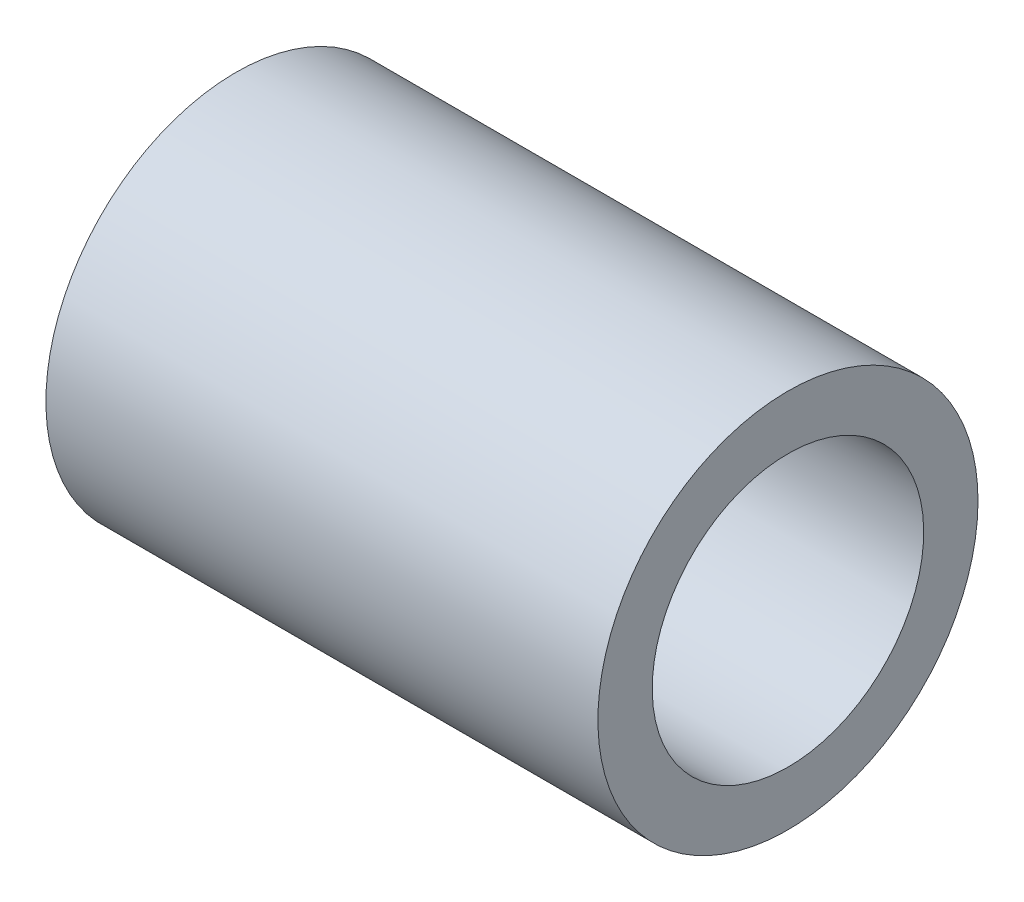
ISO-10303-21;
HEADER;
FILE_DESCRIPTION(('STEP AP214'),'2;1');
FILE_NAME('part.step','',(''),(''),'','','');
FILE_SCHEMA(('AUTOMOTIVE_DESIGN { 1 0 10303 214 1 1 1 1 }'));
ENDSEC;
DATA;
#1=APPLICATION_CONTEXT('core data for automotive mechanical design processes');
#2=APPLICATION_PROTOCOL_DEFINITION('international standard','automotive_design',2000,#1);
#3=PRODUCT_CONTEXT('',#1,'mechanical');
#4=PRODUCT('Part','Part','',(#3));
#5=PRODUCT_RELATED_PRODUCT_CATEGORY('part','',(#4));
#6=PRODUCT_DEFINITION_FORMATION('','',#4);
#7=PRODUCT_DEFINITION_CONTEXT('part definition',#1,'design');
#8=PRODUCT_DEFINITION('design','',#6,#7);
#9=PRODUCT_DEFINITION_SHAPE('','',#8);
#10=(LENGTH_UNIT() NAMED_UNIT(*) SI_UNIT(.MILLI.,.METRE.));
#11=(NAMED_UNIT(*) PLANE_ANGLE_UNIT() SI_UNIT($,.RADIAN.));
#12=(NAMED_UNIT(*) SI_UNIT($,.STERADIAN.) SOLID_ANGLE_UNIT());
#13=UNCERTAINTY_MEASURE_WITH_UNIT(LENGTH_MEASURE(1.E-05),#10,'distance_accuracy_value','');
#14=(GEOMETRIC_REPRESENTATION_CONTEXT(3) GLOBAL_UNCERTAINTY_ASSIGNED_CONTEXT((#13)) GLOBAL_UNIT_ASSIGNED_CONTEXT((#10,
#11,#12)) REPRESENTATION_CONTEXT('',''));
#15=CARTESIAN_POINT('',(0.,0.,0.));
#16=DIRECTION('',(0.,0.,1.));
#17=DIRECTION('',(1.,0.,0.));
#18=AXIS2_PLACEMENT_3D('',#15,#16,#17);
#19=CARTESIAN_POINT('',(-92.500000000003,37.9999999999994,48.9181547372543));
#20=DIRECTION('',(-1.,0.,0.));
#21=DIRECTION('',(0.,-0.304489416854202,0.952515719042887));
#22=AXIS2_PLACEMENT_3D('',#19,#20,#21);
#23=CYLINDRICAL_SURFACE('',#22,3.);
#24=CARTESIAN_POINT('',(-92.500000000003,37.9999999999994,48.9181547372543));
#25=DIRECTION('',(1.,0.,0.));
#26=DIRECTION('',(0.,0.304489416854202,-0.952515719042887));
#27=AXIS2_PLACEMENT_3D('',#24,#25,#26);
#28=CIRCLE('',#27,3.);
#29=CARTESIAN_POINT('',(-92.500000000003,38.913468250562,46.0606075801256));
#30=VERTEX_POINT('',#29);
#31=EDGE_CURVE('E9',#30,#30,#28,.T.);
#32=ORIENTED_EDGE('',*,*,#31,.T.);
#33=EDGE_LOOP('',(#32));
#34=FACE_BOUND('',#33,.T.);
#35=CARTESIAN_POINT('',(-104.700000000003,37.9999999999994,48.9181547372543));
#36=DIRECTION('',(1.,0.,0.));
#37=DIRECTION('',(0.,0.304489416854202,-0.952515719042887));
#38=AXIS2_PLACEMENT_3D('',#35,#36,#37);
#39=CIRCLE('',#38,3.);
#40=CARTESIAN_POINT('',(-104.700000000003,38.913468250562,46.0606075801256));
#41=VERTEX_POINT('',#40);
#42=EDGE_CURVE('E31',#41,#41,#39,.T.);
#43=ORIENTED_EDGE('',*,*,#42,.F.);
#44=EDGE_LOOP('',(#43));
#45=FACE_BOUND('',#44,.T.);
#46=ADVANCED_FACE('F14',(#34,#45),#23,.F.);
#47=CARTESIAN_POINT('',(-92.500000000003,37.9999999999994,48.9181547372543));
#48=DIRECTION('',(-1.,0.,0.));
#49=DIRECTION('',(0.,-0.304489416854202,0.952515719042887));
#50=AXIS2_PLACEMENT_3D('',#47,#48,#49);
#51=CYLINDRICAL_SURFACE('',#50,4.2);
#52=CARTESIAN_POINT('',(-92.500000000003,37.9999999999994,48.9181547372543));
#53=DIRECTION('',(1.,0.,0.));
#54=DIRECTION('',(0.,0.304489416854202,-0.952515719042887));
#55=AXIS2_PLACEMENT_3D('',#52,#53,#54);
#56=CIRCLE('',#55,4.2);
#57=CARTESIAN_POINT('',(-92.500000000003,39.278855550787,44.9175887172742));
#58=VERTEX_POINT('',#57);
#59=EDGE_CURVE('E17',#58,#58,#56,.T.);
#60=ORIENTED_EDGE('',*,*,#59,.F.);
#61=EDGE_LOOP('',(#60));
#62=FACE_BOUND('',#61,.T.);
#63=CARTESIAN_POINT('',(-104.700000000003,37.9999999999994,48.9181547372543));
#64=DIRECTION('',(1.,0.,0.));
#65=DIRECTION('',(0.,0.304489416854202,-0.952515719042887));
#66=AXIS2_PLACEMENT_3D('',#63,#64,#65);
#67=CIRCLE('',#66,4.2);
#68=CARTESIAN_POINT('',(-104.700000000003,39.278855550787,44.9175887172742));
#69=VERTEX_POINT('',#68);
#70=EDGE_CURVE('E33',#69,#69,#67,.T.);
#71=ORIENTED_EDGE('',*,*,#70,.T.);
#72=EDGE_LOOP('',(#71));
#73=FACE_BOUND('',#72,.T.);
#74=ADVANCED_FACE('F42',(#62,#73),#51,.T.);
#75=CARTESIAN_POINT('',(-92.500000000003,41.5745745285111,52.8860216274688));
#76=DIRECTION('',(1.,0.,0.));
#77=DIRECTION('',(0.,1.,0.));
#78=AXIS2_PLACEMENT_3D('',#75,#76,#77);
#79=PLANE('',#78);
#80=ORIENTED_EDGE('',*,*,#31,.F.);
#81=EDGE_LOOP('',(#80));
#82=FACE_BOUND('',#81,.T.);
#83=ORIENTED_EDGE('',*,*,#59,.T.);
#84=EDGE_LOOP('',(#83));
#85=FACE_BOUND('',#84,.T.);
#86=ADVANCED_FACE('F46',(#82,#85),#79,.T.);
#87=CARTESIAN_POINT('',(-104.700000000003,41.5745745285111,52.8860216274688));
#88=DIRECTION('',(1.,0.,0.));
#89=DIRECTION('',(0.,1.,0.));
#90=AXIS2_PLACEMENT_3D('',#87,#88,#89);
#91=PLANE('',#90);
#92=ORIENTED_EDGE('',*,*,#42,.T.);
#93=EDGE_LOOP('',(#92));
#94=FACE_BOUND('',#93,.T.);
#95=ORIENTED_EDGE('',*,*,#70,.F.);
#96=EDGE_LOOP('',(#95));
#97=FACE_BOUND('',#96,.T.);
#98=ADVANCED_FACE('F44',(#94,#97),#91,.F.);
#99=CLOSED_SHELL('',(#46,#74,#86,#98));
#100=MANIFOLD_SOLID_BREP('B1',#99);
#101=ADVANCED_BREP_SHAPE_REPRESENTATION('',(#18,#100),#14);
#102=SHAPE_DEFINITION_REPRESENTATION(#9,#101);
ENDSEC;
END-ISO-10303-21;
